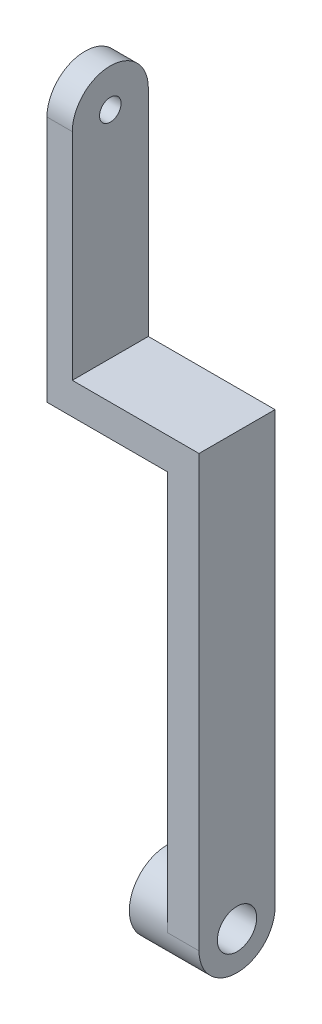
ISO-10303-21;
HEADER;
FILE_DESCRIPTION(('STEP AP214'),'2;1');
FILE_NAME('part.step','',(''),(''),'','','');
FILE_SCHEMA(('AUTOMOTIVE_DESIGN { 1 0 10303 214 1 1 1 1 }'));
ENDSEC;
DATA;
#1=APPLICATION_CONTEXT('core data for automotive mechanical design processes');
#2=APPLICATION_PROTOCOL_DEFINITION('international standard','automotive_design',2000,#1);
#3=PRODUCT_CONTEXT('',#1,'mechanical');
#4=PRODUCT('Part','Part','',(#3));
#5=PRODUCT_RELATED_PRODUCT_CATEGORY('part','',(#4));
#6=PRODUCT_DEFINITION_FORMATION('','',#4);
#7=PRODUCT_DEFINITION_CONTEXT('part definition',#1,'design');
#8=PRODUCT_DEFINITION('design','',#6,#7);
#9=PRODUCT_DEFINITION_SHAPE('','',#8);
#10=(LENGTH_UNIT() NAMED_UNIT(*) SI_UNIT(.MILLI.,.METRE.));
#11=(NAMED_UNIT(*) PLANE_ANGLE_UNIT() SI_UNIT($,.RADIAN.));
#12=(NAMED_UNIT(*) SI_UNIT($,.STERADIAN.) SOLID_ANGLE_UNIT());
#13=UNCERTAINTY_MEASURE_WITH_UNIT(LENGTH_MEASURE(1.E-05),#10,'distance_accuracy_value','');
#14=(GEOMETRIC_REPRESENTATION_CONTEXT(3) GLOBAL_UNCERTAINTY_ASSIGNED_CONTEXT((#13)) GLOBAL_UNIT_ASSIGNED_CONTEXT((#10,
#11,#12)) REPRESENTATION_CONTEXT('',''));
#15=CARTESIAN_POINT('',(0.,0.,0.));
#16=DIRECTION('',(0.,0.,1.));
#17=DIRECTION('',(1.,0.,0.));
#18=AXIS2_PLACEMENT_3D('',#15,#16,#17);
#19=CARTESIAN_POINT('',(7.5,-2.5,6.));
#20=DIRECTION('',(1.,0.,0.));
#21=DIRECTION('',(0.,1.,0.));
#22=AXIS2_PLACEMENT_3D('',#19,#20,#21);
#23=PLANE('',#22);
#24=CARTESIAN_POINT('',(7.50000000000001,-34.,3.));
#25=DIRECTION('',(-1.,0.,0.));
#26=DIRECTION('',(0.,-1.,0.));
#27=AXIS2_PLACEMENT_3D('',#24,#25,#26);
#28=CIRCLE('',#27,3.);
#29=CARTESIAN_POINT('',(7.5,-34.,6.));
#30=VERTEX_POINT('',#29);
#31=CARTESIAN_POINT('',(7.50000000000001,-34.,0.));
#32=VERTEX_POINT('',#31);
#33=EDGE_CURVE('E58',#30,#32,#28,.T.);
#34=ORIENTED_EDGE('',*,*,#33,.F.);
#35=DIRECTION('',(0.,-1.,0.));
#36=VECTOR('',#35,1.);
#37=CARTESIAN_POINT('',(7.5,-2.5,6.));
#38=LINE('',#37,#36);
#39=CARTESIAN_POINT('',(7.5,-2.5,6.));
#40=VERTEX_POINT('',#39);
#41=EDGE_CURVE('E145',#40,#30,#38,.T.);
#42=ORIENTED_EDGE('',*,*,#41,.F.);
#43=DIRECTION('',(0.,0.,-1.));
#44=VECTOR('',#43,1.);
#45=CARTESIAN_POINT('',(7.5,-2.5,6.));
#46=LINE('',#45,#44);
#47=CARTESIAN_POINT('',(7.5,-2.5,0.));
#48=VERTEX_POINT('',#47);
#49=EDGE_CURVE('E103',#40,#48,#46,.T.);
#50=ORIENTED_EDGE('',*,*,#49,.T.);
#51=DIRECTION('',(0.,-1.,0.));
#52=VECTOR('',#51,1.);
#53=CARTESIAN_POINT('',(7.5,-2.5,0.));
#54=LINE('',#53,#52);
#55=EDGE_CURVE('E100',#48,#32,#54,.T.);
#56=ORIENTED_EDGE('',*,*,#55,.T.);
#57=EDGE_LOOP('',(#34,#42,#50,#56));
#58=FACE_BOUND('',#57,.T.);
#59=ADVANCED_FACE('F36',(#58),#23,.F.);
#60=CARTESIAN_POINT('',(10.,-34.,3.));
#61=DIRECTION('',(1.,0.,0.));
#62=DIRECTION('',(0.,0.,-1.));
#63=AXIS2_PLACEMENT_3D('',#60,#61,#62);
#64=CYLINDRICAL_SURFACE('',#63,3.);
#65=DIRECTION('',(-1.,0.,0.));
#66=VECTOR('',#65,1.);
#67=CARTESIAN_POINT('',(10.,-34.,0.));
#68=LINE('',#67,#66);
#69=CARTESIAN_POINT('',(10.,-34.,0.));
#70=VERTEX_POINT('',#69);
#71=EDGE_CURVE('E110',#70,#32,#68,.T.);
#72=ORIENTED_EDGE('',*,*,#71,.F.);
#73=CARTESIAN_POINT('',(10.,-34.,3.));
#74=DIRECTION('',(-1.,0.,0.));
#75=DIRECTION('',(0.,-1.,0.));
#76=AXIS2_PLACEMENT_3D('',#73,#74,#75);
#77=CIRCLE('',#76,3.);
#78=CARTESIAN_POINT('',(10.,-34.,6.));
#79=VERTEX_POINT('',#78);
#80=EDGE_CURVE('E11',#79,#70,#77,.F.);
#81=ORIENTED_EDGE('',*,*,#80,.F.);
#82=DIRECTION('',(1.,0.,0.));
#83=VECTOR('',#82,1.);
#84=CARTESIAN_POINT('',(0.,-34.,6.));
#85=LINE('',#84,#83);
#86=EDGE_CURVE('E45',#30,#79,#85,.T.);
#87=ORIENTED_EDGE('',*,*,#86,.F.);
#88=ORIENTED_EDGE('',*,*,#33,.T.);
#89=EDGE_LOOP('',(#72,#81,#87,#88));
#90=FACE_BOUND('',#89,.T.);
#91=CARTESIAN_POINT('',(4.5,-34.,3.));
#92=DIRECTION('',(-1.,0.,0.));
#93=DIRECTION('',(0.,-1.,0.));
#94=AXIS2_PLACEMENT_3D('',#91,#92,#93);
#95=CIRCLE('',#94,3.);
#96=CARTESIAN_POINT('',(4.5,-37.,3.));
#97=VERTEX_POINT('',#96);
#98=EDGE_CURVE('E117',#97,#97,#95,.T.);
#99=ORIENTED_EDGE('',*,*,#98,.F.);
#100=EDGE_LOOP('',(#99));
#101=FACE_BOUND('',#100,.T.);
#102=ADVANCED_FACE('F39',(#90,#101),#64,.T.);
#103=CARTESIAN_POINT('',(-2.,17.,3.));
#104=DIRECTION('',(-1.,0.,0.));
#105=DIRECTION('',(0.,0.,1.));
#106=AXIS2_PLACEMENT_3D('',#103,#104,#105);
#107=CYLINDRICAL_SURFACE('',#106,3.);
#108=DIRECTION('',(1.,0.,0.));
#109=VECTOR('',#108,1.);
#110=CARTESIAN_POINT('',(-2.,17.,0.));
#111=LINE('',#110,#109);
#112=CARTESIAN_POINT('',(-2.,17.,0.));
#113=VERTEX_POINT('',#112);
#114=CARTESIAN_POINT('',(0.,17.,0.));
#115=VERTEX_POINT('',#114);
#116=EDGE_CURVE('E168',#113,#115,#111,.T.);
#117=ORIENTED_EDGE('',*,*,#116,.F.);
#118=CARTESIAN_POINT('',(-2.,17.,3.));
#119=DIRECTION('',(1.,0.,0.));
#120=DIRECTION('',(0.,1.,0.));
#121=AXIS2_PLACEMENT_3D('',#118,#119,#120);
#122=CIRCLE('',#121,3.);
#123=CARTESIAN_POINT('',(-2.,17.,6.));
#124=VERTEX_POINT('',#123);
#125=EDGE_CURVE('E174',#124,#113,#122,.F.);
#126=ORIENTED_EDGE('',*,*,#125,.F.);
#127=DIRECTION('',(-1.,0.,0.));
#128=VECTOR('',#127,1.);
#129=CARTESIAN_POINT('',(0.,17.,6.));
#130=LINE('',#129,#128);
#131=CARTESIAN_POINT('',(0.,17.,6.));
#132=VERTEX_POINT('',#131);
#133=EDGE_CURVE('E171',#132,#124,#130,.T.);
#134=ORIENTED_EDGE('',*,*,#133,.F.);
#135=CARTESIAN_POINT('',(0.,17.,3.));
#136=DIRECTION('',(-1.,0.,0.));
#137=DIRECTION('',(0.,0.,1.));
#138=AXIS2_PLACEMENT_3D('',#135,#136,#137);
#139=CIRCLE('',#138,3.);
#140=EDGE_CURVE('E113',#115,#132,#139,.F.);
#141=ORIENTED_EDGE('',*,*,#140,.F.);
#142=EDGE_LOOP('',(#117,#126,#134,#141));
#143=FACE_BOUND('',#142,.T.);
#144=ADVANCED_FACE('F192',(#143),#107,.T.);
#145=CARTESIAN_POINT('',(0.,0.,6.));
#146=DIRECTION('',(0.,-1.,0.));
#147=DIRECTION('',(0.,0.,-1.));
#148=AXIS2_PLACEMENT_3D('',#145,#146,#147);
#149=PLANE('',#148);
#150=DIRECTION('',(-1.,0.,0.));
#151=VECTOR('',#150,1.);
#152=CARTESIAN_POINT('',(0.,0.,0.));
#153=LINE('',#152,#151);
#154=CARTESIAN_POINT('',(10.,0.,0.));
#155=VERTEX_POINT('',#154);
#156=CARTESIAN_POINT('',(0.,0.,0.));
#157=VERTEX_POINT('',#156);
#158=EDGE_CURVE('E134',#155,#157,#153,.T.);
#159=ORIENTED_EDGE('',*,*,#158,.T.);
#160=DIRECTION('',(0.,0.,-1.));
#161=VECTOR('',#160,1.);
#162=CARTESIAN_POINT('',(0.,0.,6.));
#163=LINE('',#162,#161);
#164=CARTESIAN_POINT('',(0.,0.,6.));
#165=VERTEX_POINT('',#164);
#166=EDGE_CURVE('E165',#165,#157,#163,.T.);
#167=ORIENTED_EDGE('',*,*,#166,.F.);
#168=DIRECTION('',(-1.,0.,0.));
#169=VECTOR('',#168,1.);
#170=CARTESIAN_POINT('',(0.,0.,6.));
#171=LINE('',#170,#169);
#172=CARTESIAN_POINT('',(10.,0.,6.));
#173=VERTEX_POINT('',#172);
#174=EDGE_CURVE('E135',#173,#165,#171,.T.);
#175=ORIENTED_EDGE('',*,*,#174,.F.);
#176=DIRECTION('',(0.,0.,-1.));
#177=VECTOR('',#176,1.);
#178=CARTESIAN_POINT('',(10.,0.,6.));
#179=LINE('',#178,#177);
#180=EDGE_CURVE('E149',#173,#155,#179,.T.);
#181=ORIENTED_EDGE('',*,*,#180,.T.);
#182=EDGE_LOOP('',(#159,#167,#175,#181));
#183=FACE_BOUND('',#182,.T.);
#184=ADVANCED_FACE('F185',(#183),#149,.F.);
#185=CARTESIAN_POINT('',(0.,0.,6.));
#186=DIRECTION('',(-1.,0.,0.));
#187=DIRECTION('',(0.,0.,1.));
#188=AXIS2_PLACEMENT_3D('',#185,#186,#187);
#189=PLANE('',#188);
#190=CARTESIAN_POINT('',(0.,17.,3.));
#191=DIRECTION('',(-1.,0.,0.));
#192=DIRECTION('',(0.,0.,1.));
#193=AXIS2_PLACEMENT_3D('',#190,#191,#192);
#194=CIRCLE('',#193,0.850000000000003);
#195=CARTESIAN_POINT('',(0.,17.,3.85));
#196=VERTEX_POINT('',#195);
#197=EDGE_CURVE('E129',#196,#196,#194,.T.);
#198=ORIENTED_EDGE('',*,*,#197,.T.);
#199=EDGE_LOOP('',(#198));
#200=FACE_BOUND('',#199,.T.);
#201=DIRECTION('',(0.,1.,0.));
#202=VECTOR('',#201,1.);
#203=CARTESIAN_POINT('',(0.,0.,0.));
#204=LINE('',#203,#202);
#205=EDGE_CURVE('E152',#157,#115,#204,.T.);
#206=ORIENTED_EDGE('',*,*,#205,.T.);
#207=ORIENTED_EDGE('',*,*,#140,.T.);
#208=DIRECTION('',(0.,1.,0.));
#209=VECTOR('',#208,1.);
#210=CARTESIAN_POINT('',(0.,0.,6.));
#211=LINE('',#210,#209);
#212=EDGE_CURVE('E138',#165,#132,#211,.T.);
#213=ORIENTED_EDGE('',*,*,#212,.F.);
#214=ORIENTED_EDGE('',*,*,#166,.T.);
#215=EDGE_LOOP('',(#206,#207,#213,#214));
#216=FACE_BOUND('',#215,.T.);
#217=ADVANCED_FACE('F189',(#200,#216),#189,.F.);
#218=CARTESIAN_POINT('',(-2.,8.27363836641126,6.));
#219=DIRECTION('',(1.,0.,0.));
#220=DIRECTION('',(0.,1.,0.));
#221=AXIS2_PLACEMENT_3D('',#218,#219,#220);
#222=PLANE('',#221);
#223=CARTESIAN_POINT('',(-1.99999999999999,17.,3.));
#224=DIRECTION('',(-1.,0.,0.));
#225=DIRECTION('',(0.,-1.,0.));
#226=AXIS2_PLACEMENT_3D('',#223,#224,#225);
#227=CIRCLE('',#226,0.850000000000003);
#228=CARTESIAN_POINT('',(-1.99999999999999,16.15,3.));
#229=VERTEX_POINT('',#228);
#230=EDGE_CURVE('E126',#229,#229,#227,.T.);
#231=ORIENTED_EDGE('',*,*,#230,.F.);
#232=EDGE_LOOP('',(#231));
#233=FACE_BOUND('',#232,.T.);
#234=DIRECTION('',(0.,-1.,0.));
#235=VECTOR('',#234,1.);
#236=CARTESIAN_POINT('',(-2.,8.27363836641126,6.));
#237=LINE('',#236,#235);
#238=CARTESIAN_POINT('',(-2.,-2.5,6.));
#239=VERTEX_POINT('',#238);
#240=EDGE_CURVE('E141',#124,#239,#237,.T.);
#241=ORIENTED_EDGE('',*,*,#240,.F.);
#242=ORIENTED_EDGE('',*,*,#125,.T.);
#243=DIRECTION('',(0.,-1.,0.));
#244=VECTOR('',#243,1.);
#245=CARTESIAN_POINT('',(-2.,8.27363836641126,0.));
#246=LINE('',#245,#244);
#247=CARTESIAN_POINT('',(-2.,-2.5,0.));
#248=VERTEX_POINT('',#247);
#249=EDGE_CURVE('E155',#113,#248,#246,.T.);
#250=ORIENTED_EDGE('',*,*,#249,.T.);
#251=DIRECTION('',(0.,0.,-1.));
#252=VECTOR('',#251,1.);
#253=CARTESIAN_POINT('',(-2.,-2.5,6.));
#254=LINE('',#253,#252);
#255=EDGE_CURVE('E162',#239,#248,#254,.T.);
#256=ORIENTED_EDGE('',*,*,#255,.F.);
#257=EDGE_LOOP('',(#241,#242,#250,#256));
#258=FACE_BOUND('',#257,.T.);
#259=ADVANCED_FACE('F195',(#233,#258),#222,.F.);
#260=CARTESIAN_POINT('',(-2.,-2.5,6.));
#261=DIRECTION('',(0.,1.,0.));
#262=DIRECTION('',(0.,0.,1.));
#263=AXIS2_PLACEMENT_3D('',#260,#261,#262);
#264=PLANE('',#263);
#265=DIRECTION('',(1.,0.,0.));
#266=VECTOR('',#265,1.);
#267=CARTESIAN_POINT('',(-2.,-2.5,0.));
#268=LINE('',#267,#266);
#269=EDGE_CURVE('E107',#248,#48,#268,.T.);
#270=ORIENTED_EDGE('',*,*,#269,.T.);
#271=ORIENTED_EDGE('',*,*,#49,.F.);
#272=DIRECTION('',(1.,0.,0.));
#273=VECTOR('',#272,1.);
#274=CARTESIAN_POINT('',(-2.,-2.5,6.));
#275=LINE('',#274,#273);
#276=EDGE_CURVE('E143',#239,#40,#275,.T.);
#277=ORIENTED_EDGE('',*,*,#276,.F.);
#278=ORIENTED_EDGE('',*,*,#255,.T.);
#279=EDGE_LOOP('',(#270,#271,#277,#278));
#280=FACE_BOUND('',#279,.T.);
#281=ADVANCED_FACE('F199',(#280),#264,.F.);
#282=CARTESIAN_POINT('',(10.,0.,6.));
#283=DIRECTION('',(-1.,0.,0.));
#284=DIRECTION('',(0.,-1.,0.));
#285=AXIS2_PLACEMENT_3D('',#282,#283,#284);
#286=PLANE('',#285);
#287=CARTESIAN_POINT('',(10.,-34.,3.));
#288=DIRECTION('',(-1.,0.,0.));
#289=DIRECTION('',(0.,-1.,0.));
#290=AXIS2_PLACEMENT_3D('',#287,#288,#289);
#291=CIRCLE('',#290,1.55);
#292=CARTESIAN_POINT('',(10.,-35.55,3.));
#293=VERTEX_POINT('',#292);
#294=EDGE_CURVE('E121',#293,#293,#291,.T.);
#295=ORIENTED_EDGE('',*,*,#294,.T.);
#296=EDGE_LOOP('',(#295));
#297=FACE_BOUND('',#296,.T.);
#298=DIRECTION('',(0.,1.,0.));
#299=VECTOR('',#298,1.);
#300=CARTESIAN_POINT('',(10.,0.,6.));
#301=LINE('',#300,#299);
#302=EDGE_CURVE('E147',#79,#173,#301,.T.);
#303=ORIENTED_EDGE('',*,*,#302,.F.);
#304=ORIENTED_EDGE('',*,*,#80,.T.);
#305=DIRECTION('',(0.,1.,0.));
#306=VECTOR('',#305,1.);
#307=CARTESIAN_POINT('',(10.,0.,0.));
#308=LINE('',#307,#306);
#309=EDGE_CURVE('E106',#70,#155,#308,.T.);
#310=ORIENTED_EDGE('',*,*,#309,.T.);
#311=ORIENTED_EDGE('',*,*,#180,.F.);
#312=EDGE_LOOP('',(#303,#304,#310,#311));
#313=FACE_BOUND('',#312,.T.);
#314=ADVANCED_FACE('F181',(#297,#313),#286,.F.);
#315=CARTESIAN_POINT('',(0.,0.,6.));
#316=DIRECTION('',(0.,0.,-1.));
#317=DIRECTION('',(-1.,0.,0.));
#318=AXIS2_PLACEMENT_3D('',#315,#316,#317);
#319=PLANE('',#318);
#320=ORIENTED_EDGE('',*,*,#41,.T.);
#321=ORIENTED_EDGE('',*,*,#86,.T.);
#322=ORIENTED_EDGE('',*,*,#302,.T.);
#323=ORIENTED_EDGE('',*,*,#174,.T.);
#324=ORIENTED_EDGE('',*,*,#212,.T.);
#325=ORIENTED_EDGE('',*,*,#133,.T.);
#326=ORIENTED_EDGE('',*,*,#240,.T.);
#327=ORIENTED_EDGE('',*,*,#276,.T.);
#328=EDGE_LOOP('',(#320,#321,#322,#323,#324,#325,#326,#327));
#329=FACE_BOUND('',#328,.T.);
#330=ADVANCED_FACE('F178',(#329),#319,.F.);
#331=CARTESIAN_POINT('',(0.,0.,0.));
#332=DIRECTION('',(0.,0.,-1.));
#333=DIRECTION('',(-1.,0.,0.));
#334=AXIS2_PLACEMENT_3D('',#331,#332,#333);
#335=PLANE('',#334);
#336=ORIENTED_EDGE('',*,*,#309,.F.);
#337=ORIENTED_EDGE('',*,*,#71,.T.);
#338=ORIENTED_EDGE('',*,*,#55,.F.);
#339=ORIENTED_EDGE('',*,*,#269,.F.);
#340=ORIENTED_EDGE('',*,*,#249,.F.);
#341=ORIENTED_EDGE('',*,*,#116,.T.);
#342=ORIENTED_EDGE('',*,*,#205,.F.);
#343=ORIENTED_EDGE('',*,*,#158,.F.);
#344=EDGE_LOOP('',(#336,#337,#338,#339,#340,#341,#342,#343));
#345=FACE_BOUND('',#344,.T.);
#346=ADVANCED_FACE('F111',(#345),#335,.T.);
#347=CARTESIAN_POINT('',(10.,-34.,3.));
#348=DIRECTION('',(-1.,0.,0.));
#349=DIRECTION('',(0.,-1.,0.));
#350=AXIS2_PLACEMENT_3D('',#347,#348,#349);
#351=CYLINDRICAL_SURFACE('',#350,1.55);
#352=ORIENTED_EDGE('',*,*,#294,.F.);
#353=EDGE_LOOP('',(#352));
#354=FACE_BOUND('',#353,.T.);
#355=CARTESIAN_POINT('',(4.5,-34.,3.));
#356=DIRECTION('',(-1.,0.,0.));
#357=DIRECTION('',(0.,-1.,0.));
#358=AXIS2_PLACEMENT_3D('',#355,#356,#357);
#359=CIRCLE('',#358,1.55000000000001);
#360=CARTESIAN_POINT('',(4.5,-35.55,3.));
#361=VERTEX_POINT('',#360);
#362=EDGE_CURVE('E118',#361,#361,#359,.T.);
#363=ORIENTED_EDGE('',*,*,#362,.T.);
#364=EDGE_LOOP('',(#363));
#365=FACE_BOUND('',#364,.T.);
#366=ADVANCED_FACE('F218',(#354,#365),#351,.F.);
#367=CARTESIAN_POINT('',(10.,17.,3.));
#368=DIRECTION('',(-1.,0.,0.));
#369=DIRECTION('',(0.,-1.,0.));
#370=AXIS2_PLACEMENT_3D('',#367,#368,#369);
#371=CYLINDRICAL_SURFACE('',#370,0.850000000000003);
#372=ORIENTED_EDGE('',*,*,#230,.T.);
#373=EDGE_LOOP('',(#372));
#374=FACE_BOUND('',#373,.T.);
#375=ORIENTED_EDGE('',*,*,#197,.F.);
#376=EDGE_LOOP('',(#375));
#377=FACE_BOUND('',#376,.T.);
#378=ADVANCED_FACE('F223',(#374,#377),#371,.F.);
#379=CARTESIAN_POINT('',(4.5,-34.,3.));
#380=DIRECTION('',(-1.,0.,0.));
#381=DIRECTION('',(0.,-1.,0.));
#382=AXIS2_PLACEMENT_3D('',#379,#380,#381);
#383=PLANE('',#382);
#384=ORIENTED_EDGE('',*,*,#98,.T.);
#385=EDGE_LOOP('',(#384));
#386=FACE_BOUND('',#385,.T.);
#387=ORIENTED_EDGE('',*,*,#362,.F.);
#388=EDGE_LOOP('',(#387));
#389=FACE_BOUND('',#388,.T.);
#390=ADVANCED_FACE('F227',(#386,#389),#383,.T.);
#391=CLOSED_SHELL('',(#59,#102,#144,#184,#217,#259,#281,#314,#330,#346,#366,#378,#390));
#392=MANIFOLD_SOLID_BREP('B2',#391);
#393=ADVANCED_BREP_SHAPE_REPRESENTATION('',(#18,#392),#14);
#394=SHAPE_DEFINITION_REPRESENTATION(#9,#393);
ENDSEC;
END-ISO-10303-21;
